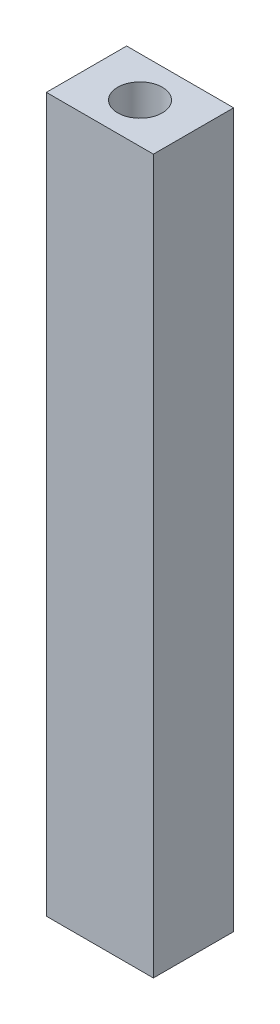
ISO-10303-21;
HEADER;
FILE_DESCRIPTION(('STEP AP214'),'2;1');
FILE_NAME('part.step','',(''),(''),'','','');
FILE_SCHEMA(('AUTOMOTIVE_DESIGN { 1 0 10303 214 1 1 1 1 }'));
ENDSEC;
DATA;
#1=APPLICATION_CONTEXT('core data for automotive mechanical design processes');
#2=APPLICATION_PROTOCOL_DEFINITION('international standard','automotive_design',2000,#1);
#3=PRODUCT_CONTEXT('',#1,'mechanical');
#4=PRODUCT('Part','Part','',(#3));
#5=PRODUCT_RELATED_PRODUCT_CATEGORY('part','',(#4));
#6=PRODUCT_DEFINITION_FORMATION('','',#4);
#7=PRODUCT_DEFINITION_CONTEXT('part definition',#1,'design');
#8=PRODUCT_DEFINITION('design','',#6,#7);
#9=PRODUCT_DEFINITION_SHAPE('','',#8);
#10=(LENGTH_UNIT() NAMED_UNIT(*) SI_UNIT(.MILLI.,.METRE.));
#11=(NAMED_UNIT(*) PLANE_ANGLE_UNIT() SI_UNIT($,.RADIAN.));
#12=(NAMED_UNIT(*) SI_UNIT($,.STERADIAN.) SOLID_ANGLE_UNIT());
#13=UNCERTAINTY_MEASURE_WITH_UNIT(LENGTH_MEASURE(1.E-05),#10,'distance_accuracy_value','');
#14=(GEOMETRIC_REPRESENTATION_CONTEXT(3) GLOBAL_UNCERTAINTY_ASSIGNED_CONTEXT((#13)) GLOBAL_UNIT_ASSIGNED_CONTEXT((#10,
#11,#12)) REPRESENTATION_CONTEXT('',''));
#15=CARTESIAN_POINT('',(0.,0.,0.));
#16=DIRECTION('',(0.,0.,1.));
#17=DIRECTION('',(1.,0.,0.));
#18=AXIS2_PLACEMENT_3D('',#15,#16,#17);
#19=CARTESIAN_POINT('',(6.,80.,4.5));
#20=DIRECTION('',(-1.,0.,0.));
#21=DIRECTION('',(0.,0.,1.));
#22=AXIS2_PLACEMENT_3D('',#19,#20,#21);
#23=PLANE('',#22);
#24=DIRECTION('',(0.,0.,-1.));
#25=VECTOR('',#24,1.);
#26=CARTESIAN_POINT('',(6.,0.,4.5));
#27=LINE('',#26,#25);
#28=CARTESIAN_POINT('',(6.,0.,4.5));
#29=VERTEX_POINT('',#28);
#30=CARTESIAN_POINT('',(6.,0.,-4.5));
#31=VERTEX_POINT('',#30);
#32=EDGE_CURVE('E101',#29,#31,#27,.T.);
#33=ORIENTED_EDGE('',*,*,#32,.T.);
#34=DIRECTION('',(0.,-1.,0.));
#35=VECTOR('',#34,1.);
#36=CARTESIAN_POINT('',(6.,80.,-4.5));
#37=LINE('',#36,#35);
#38=CARTESIAN_POINT('',(6.,80.,-4.5));
#39=VERTEX_POINT('',#38);
#40=EDGE_CURVE('E11',#39,#31,#37,.T.);
#41=ORIENTED_EDGE('',*,*,#40,.F.);
#42=DIRECTION('',(0.,0.,-1.));
#43=VECTOR('',#42,1.);
#44=CARTESIAN_POINT('',(6.,80.,4.5));
#45=LINE('',#44,#43);
#46=CARTESIAN_POINT('',(6.,80.,4.5));
#47=VERTEX_POINT('',#46);
#48=EDGE_CURVE('E89',#47,#39,#45,.T.);
#49=ORIENTED_EDGE('',*,*,#48,.F.);
#50=DIRECTION('',(0.,-1.,0.));
#51=VECTOR('',#50,1.);
#52=CARTESIAN_POINT('',(6.,80.,4.5));
#53=LINE('',#52,#51);
#54=EDGE_CURVE('E97',#47,#29,#53,.T.);
#55=ORIENTED_EDGE('',*,*,#54,.T.);
#56=EDGE_LOOP('',(#33,#41,#49,#55));
#57=FACE_BOUND('',#56,.T.);
#58=ADVANCED_FACE('F38',(#57),#23,.F.);
#59=CARTESIAN_POINT('',(-6.,80.,-4.5));
#60=DIRECTION('',(0.,0.,1.));
#61=DIRECTION('',(1.,0.,0.));
#62=AXIS2_PLACEMENT_3D('',#59,#60,#61);
#63=PLANE('',#62);
#64=DIRECTION('',(-1.,0.,0.));
#65=VECTOR('',#64,1.);
#66=CARTESIAN_POINT('',(-6.,0.,-4.5));
#67=LINE('',#66,#65);
#68=CARTESIAN_POINT('',(-6.,0.,-4.5));
#69=VERTEX_POINT('',#68);
#70=EDGE_CURVE('E93',#31,#69,#67,.T.);
#71=ORIENTED_EDGE('',*,*,#70,.T.);
#72=DIRECTION('',(0.,-1.,0.));
#73=VECTOR('',#72,1.);
#74=CARTESIAN_POINT('',(-6.,80.,-4.5));
#75=LINE('',#74,#73);
#76=CARTESIAN_POINT('',(-6.,80.,-4.5));
#77=VERTEX_POINT('',#76);
#78=EDGE_CURVE('E46',#77,#69,#75,.T.);
#79=ORIENTED_EDGE('',*,*,#78,.F.);
#80=DIRECTION('',(-1.,0.,0.));
#81=VECTOR('',#80,1.);
#82=CARTESIAN_POINT('',(-6.,80.,-4.5));
#83=LINE('',#82,#81);
#84=EDGE_CURVE('E84',#39,#77,#83,.T.);
#85=ORIENTED_EDGE('',*,*,#84,.F.);
#86=ORIENTED_EDGE('',*,*,#40,.T.);
#87=EDGE_LOOP('',(#71,#79,#85,#86));
#88=FACE_BOUND('',#87,.T.);
#89=ADVANCED_FACE('F92',(#88),#63,.F.);
#90=CARTESIAN_POINT('',(-6.,80.,4.5));
#91=DIRECTION('',(1.,0.,0.));
#92=DIRECTION('',(0.,0.,-1.));
#93=AXIS2_PLACEMENT_3D('',#90,#91,#92);
#94=PLANE('',#93);
#95=DIRECTION('',(0.,0.,1.));
#96=VECTOR('',#95,1.);
#97=CARTESIAN_POINT('',(-6.,0.,4.5));
#98=LINE('',#97,#96);
#99=CARTESIAN_POINT('',(-6.,0.,4.5));
#100=VERTEX_POINT('',#99);
#101=EDGE_CURVE('E71',#69,#100,#98,.T.);
#102=ORIENTED_EDGE('',*,*,#101,.T.);
#103=DIRECTION('',(0.,-1.,0.));
#104=VECTOR('',#103,1.);
#105=CARTESIAN_POINT('',(-6.,80.,4.5));
#106=LINE('',#105,#104);
#107=CARTESIAN_POINT('',(-6.,80.,4.5));
#108=VERTEX_POINT('',#107);
#109=EDGE_CURVE('E94',#108,#100,#106,.T.);
#110=ORIENTED_EDGE('',*,*,#109,.F.);
#111=DIRECTION('',(0.,0.,1.));
#112=VECTOR('',#111,1.);
#113=CARTESIAN_POINT('',(-6.,80.,4.5));
#114=LINE('',#113,#112);
#115=EDGE_CURVE('E87',#77,#108,#114,.T.);
#116=ORIENTED_EDGE('',*,*,#115,.F.);
#117=ORIENTED_EDGE('',*,*,#78,.T.);
#118=EDGE_LOOP('',(#102,#110,#116,#117));
#119=FACE_BOUND('',#118,.T.);
#120=ADVANCED_FACE('F95',(#119),#94,.F.);
#121=CARTESIAN_POINT('',(-6.,80.,4.5));
#122=DIRECTION('',(0.,0.,-1.));
#123=DIRECTION('',(-1.,0.,0.));
#124=AXIS2_PLACEMENT_3D('',#121,#122,#123);
#125=PLANE('',#124);
#126=DIRECTION('',(1.,0.,0.));
#127=VECTOR('',#126,1.);
#128=CARTESIAN_POINT('',(-6.,0.,4.5));
#129=LINE('',#128,#127);
#130=EDGE_CURVE('E77',#100,#29,#129,.T.);
#131=ORIENTED_EDGE('',*,*,#130,.T.);
#132=ORIENTED_EDGE('',*,*,#54,.F.);
#133=DIRECTION('',(1.,0.,0.));
#134=VECTOR('',#133,1.);
#135=CARTESIAN_POINT('',(-6.,80.,4.5));
#136=LINE('',#135,#134);
#137=EDGE_CURVE('E54',#108,#47,#136,.T.);
#138=ORIENTED_EDGE('',*,*,#137,.F.);
#139=ORIENTED_EDGE('',*,*,#109,.T.);
#140=EDGE_LOOP('',(#131,#132,#138,#139));
#141=FACE_BOUND('',#140,.T.);
#142=ADVANCED_FACE('F109',(#141),#125,.F.);
#143=CARTESIAN_POINT('',(0.,80.,0.));
#144=DIRECTION('',(0.,-1.,0.));
#145=DIRECTION('',(0.,0.,-1.));
#146=AXIS2_PLACEMENT_3D('',#143,#144,#145);
#147=PLANE('',#146);
#148=CARTESIAN_POINT('',(0.,80.,0.));
#149=DIRECTION('',(0.,1.,0.));
#150=DIRECTION('',(0.,0.,1.));
#151=AXIS2_PLACEMENT_3D('',#148,#149,#150);
#152=CIRCLE('',#151,2.5);
#153=CARTESIAN_POINT('',(0.,80.,2.5));
#154=VERTEX_POINT('',#153);
#155=EDGE_CURVE('E121',#154,#154,#152,.T.);
#156=ORIENTED_EDGE('',*,*,#155,.F.);
#157=EDGE_LOOP('',(#156));
#158=FACE_BOUND('',#157,.T.);
#159=ORIENTED_EDGE('',*,*,#48,.T.);
#160=ORIENTED_EDGE('',*,*,#84,.T.);
#161=ORIENTED_EDGE('',*,*,#115,.T.);
#162=ORIENTED_EDGE('',*,*,#137,.T.);
#163=EDGE_LOOP('',(#159,#160,#161,#162));
#164=FACE_BOUND('',#163,.T.);
#165=ADVANCED_FACE('F85',(#158,#164),#147,.F.);
#166=CARTESIAN_POINT('',(0.,0.,0.));
#167=DIRECTION('',(0.,-1.,0.));
#168=DIRECTION('',(0.,0.,-1.));
#169=AXIS2_PLACEMENT_3D('',#166,#167,#168);
#170=PLANE('',#169);
#171=CARTESIAN_POINT('',(0.,0.,0.));
#172=DIRECTION('',(0.,-1.,0.));
#173=DIRECTION('',(0.,0.,-1.));
#174=AXIS2_PLACEMENT_3D('',#171,#172,#173);
#175=CIRCLE('',#174,3.);
#176=CARTESIAN_POINT('',(0.,0.,-3.));
#177=VERTEX_POINT('',#176);
#178=EDGE_CURVE('E115',#177,#177,#175,.T.);
#179=ORIENTED_EDGE('',*,*,#178,.F.);
#180=EDGE_LOOP('',(#179));
#181=FACE_BOUND('',#180,.T.);
#182=ORIENTED_EDGE('',*,*,#32,.F.);
#183=ORIENTED_EDGE('',*,*,#130,.F.);
#184=ORIENTED_EDGE('',*,*,#101,.F.);
#185=ORIENTED_EDGE('',*,*,#70,.F.);
#186=EDGE_LOOP('',(#182,#183,#184,#185));
#187=FACE_BOUND('',#186,.T.);
#188=ADVANCED_FACE('F112',(#181,#187),#170,.T.);
#189=CARTESIAN_POINT('',(0.,15.,0.));
#190=DIRECTION('',(0.,-1.,0.));
#191=DIRECTION('',(0.,0.,-1.));
#192=AXIS2_PLACEMENT_3D('',#189,#190,#191);
#193=CYLINDRICAL_SURFACE('',#192,3.);
#194=CARTESIAN_POINT('',(0.,15.,0.));
#195=DIRECTION('',(0.,-1.,0.));
#196=DIRECTION('',(0.,0.,-1.));
#197=AXIS2_PLACEMENT_3D('',#194,#195,#196);
#198=CIRCLE('',#197,3.);
#199=CARTESIAN_POINT('',(0.,15.,-3.));
#200=VERTEX_POINT('',#199);
#201=EDGE_CURVE('E104',#200,#200,#198,.T.);
#202=ORIENTED_EDGE('',*,*,#201,.F.);
#203=EDGE_LOOP('',(#202));
#204=FACE_BOUND('',#203,.T.);
#205=ORIENTED_EDGE('',*,*,#178,.T.);
#206=EDGE_LOOP('',(#205));
#207=FACE_BOUND('',#206,.T.);
#208=ADVANCED_FACE('F142',(#204,#207),#193,.F.);
#209=CARTESIAN_POINT('',(0.,15.,0.));
#210=DIRECTION('',(0.,-1.,0.));
#211=DIRECTION('',(0.,0.,-1.));
#212=AXIS2_PLACEMENT_3D('',#209,#210,#211);
#213=PLANE('',#212);
#214=ORIENTED_EDGE('',*,*,#201,.T.);
#215=EDGE_LOOP('',(#214));
#216=FACE_BOUND('',#215,.T.);
#217=ADVANCED_FACE('F132',(#216),#213,.T.);
#218=CARTESIAN_POINT('',(0.,65.,0.));
#219=DIRECTION('',(0.,1.,0.));
#220=DIRECTION('',(0.,0.,1.));
#221=AXIS2_PLACEMENT_3D('',#218,#219,#220);
#222=CYLINDRICAL_SURFACE('',#221,2.5);
#223=CARTESIAN_POINT('',(0.,65.,0.));
#224=DIRECTION('',(0.,1.,0.));
#225=DIRECTION('',(0.,0.,1.));
#226=AXIS2_PLACEMENT_3D('',#223,#224,#225);
#227=CIRCLE('',#226,2.5);
#228=CARTESIAN_POINT('',(0.,65.,2.5));
#229=VERTEX_POINT('',#228);
#230=EDGE_CURVE('E118',#229,#229,#227,.T.);
#231=ORIENTED_EDGE('',*,*,#230,.F.);
#232=EDGE_LOOP('',(#231));
#233=FACE_BOUND('',#232,.T.);
#234=ORIENTED_EDGE('',*,*,#155,.T.);
#235=EDGE_LOOP('',(#234));
#236=FACE_BOUND('',#235,.T.);
#237=ADVANCED_FACE('F129',(#233,#236),#222,.F.);
#238=CARTESIAN_POINT('',(0.,65.,0.));
#239=DIRECTION('',(0.,1.,0.));
#240=DIRECTION('',(0.,0.,1.));
#241=AXIS2_PLACEMENT_3D('',#238,#239,#240);
#242=PLANE('',#241);
#243=ORIENTED_EDGE('',*,*,#230,.T.);
#244=EDGE_LOOP('',(#243));
#245=FACE_BOUND('',#244,.T.);
#246=ADVANCED_FACE('F127',(#245),#242,.T.);
#247=CLOSED_SHELL('',(#58,#89,#120,#142,#165,#188,#208,#217,#237,#246));
#248=MANIFOLD_SOLID_BREP('B2',#247);
#249=ADVANCED_BREP_SHAPE_REPRESENTATION('',(#18,#248),#14);
#250=SHAPE_DEFINITION_REPRESENTATION(#9,#249);
ENDSEC;
END-ISO-10303-21;
